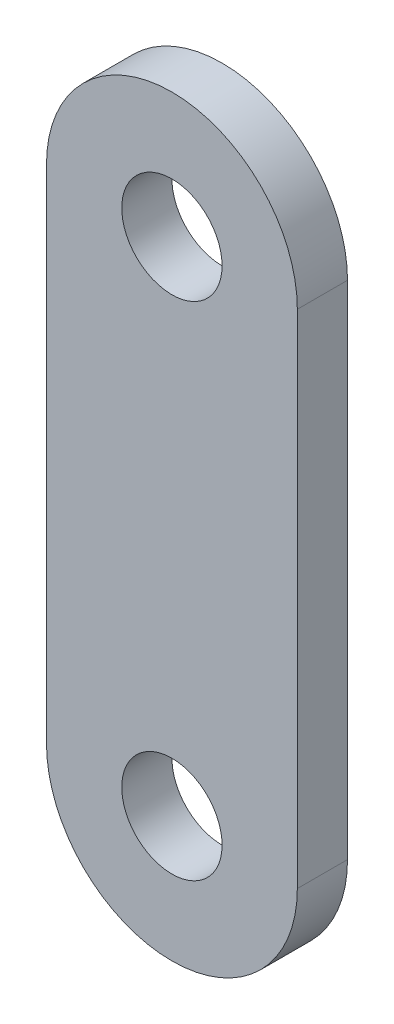
ISO-10303-21;
HEADER;
FILE_DESCRIPTION(('STEP AP214'),'2;1');
FILE_NAME('part.step','',(''),(''),'','','');
FILE_SCHEMA(('AUTOMOTIVE_DESIGN { 1 0 10303 214 1 1 1 1 }'));
ENDSEC;
DATA;
#1=APPLICATION_CONTEXT('core data for automotive mechanical design processes');
#2=APPLICATION_PROTOCOL_DEFINITION('international standard','automotive_design',2000,#1);
#3=PRODUCT_CONTEXT('',#1,'mechanical');
#4=PRODUCT('Part','Part','',(#3));
#5=PRODUCT_RELATED_PRODUCT_CATEGORY('part','',(#4));
#6=PRODUCT_DEFINITION_FORMATION('','',#4);
#7=PRODUCT_DEFINITION_CONTEXT('part definition',#1,'design');
#8=PRODUCT_DEFINITION('design','',#6,#7);
#9=PRODUCT_DEFINITION_SHAPE('','',#8);
#10=(LENGTH_UNIT() NAMED_UNIT(*) SI_UNIT(.MILLI.,.METRE.));
#11=(NAMED_UNIT(*) PLANE_ANGLE_UNIT() SI_UNIT($,.RADIAN.));
#12=(NAMED_UNIT(*) SI_UNIT($,.STERADIAN.) SOLID_ANGLE_UNIT());
#13=UNCERTAINTY_MEASURE_WITH_UNIT(LENGTH_MEASURE(1.E-05),#10,'distance_accuracy_value','');
#14=(GEOMETRIC_REPRESENTATION_CONTEXT(3) GLOBAL_UNCERTAINTY_ASSIGNED_CONTEXT((#13)) GLOBAL_UNIT_ASSIGNED_CONTEXT((#10,
#11,#12)) REPRESENTATION_CONTEXT('',''));
#15=CARTESIAN_POINT('',(0.,0.,0.));
#16=DIRECTION('',(0.,0.,1.));
#17=DIRECTION('',(1.,0.,0.));
#18=AXIS2_PLACEMENT_3D('',#15,#16,#17);
#19=CARTESIAN_POINT('',(25.,0.,10.));
#20=DIRECTION('',(0.,0.,1.));
#21=DIRECTION('',(1.,0.,0.));
#22=AXIS2_PLACEMENT_3D('',#19,#20,#21);
#23=PLANE('',#22);
#24=CARTESIAN_POINT('',(25.,100.,10.));
#25=DIRECTION('',(0.,0.,1.));
#26=DIRECTION('',(1.,0.,0.));
#27=AXIS2_PLACEMENT_3D('',#24,#25,#26);
#28=CIRCLE('',#27,10.);
#29=CARTESIAN_POINT('',(35.,100.,10.));
#30=VERTEX_POINT('',#29);
#31=EDGE_CURVE('E100',#30,#30,#28,.T.);
#32=ORIENTED_EDGE('',*,*,#31,.F.);
#33=EDGE_LOOP('',(#32));
#34=FACE_BOUND('',#33,.T.);
#35=CARTESIAN_POINT('',(25.,0.,10.));
#36=DIRECTION('',(0.,0.,1.));
#37=DIRECTION('',(1.,0.,0.));
#38=AXIS2_PLACEMENT_3D('',#35,#36,#37);
#39=CIRCLE('',#38,25.);
#40=CARTESIAN_POINT('',(0.,0.,10.));
#41=VERTEX_POINT('',#40);
#42=CARTESIAN_POINT('',(50.,0.,10.));
#43=VERTEX_POINT('',#42);
#44=EDGE_CURVE('E85',#41,#43,#39,.T.);
#45=ORIENTED_EDGE('',*,*,#44,.T.);
#46=DIRECTION('',(0.,1.,0.));
#47=VECTOR('',#46,1.);
#48=CARTESIAN_POINT('',(50.,0.,10.));
#49=LINE('',#48,#47);
#50=CARTESIAN_POINT('',(50.,100.,10.));
#51=VERTEX_POINT('',#50);
#52=EDGE_CURVE('E80',#43,#51,#49,.T.);
#53=ORIENTED_EDGE('',*,*,#52,.T.);
#54=CARTESIAN_POINT('',(25.,100.,10.));
#55=DIRECTION('',(0.,0.,1.));
#56=DIRECTION('',(1.,0.,0.));
#57=AXIS2_PLACEMENT_3D('',#54,#55,#56);
#58=CIRCLE('',#57,25.);
#59=CARTESIAN_POINT('',(0.,100.,10.));
#60=VERTEX_POINT('',#59);
#61=EDGE_CURVE('E83',#51,#60,#58,.T.);
#62=ORIENTED_EDGE('',*,*,#61,.T.);
#63=DIRECTION('',(0.,-1.,0.));
#64=VECTOR('',#63,1.);
#65=CARTESIAN_POINT('',(0.,100.,10.));
#66=LINE('',#65,#64);
#67=EDGE_CURVE('E50',#60,#41,#66,.T.);
#68=ORIENTED_EDGE('',*,*,#67,.T.);
#69=EDGE_LOOP('',(#45,#53,#62,#68));
#70=FACE_BOUND('',#69,.T.);
#71=CARTESIAN_POINT('',(25.,0.,10.));
#72=DIRECTION('',(0.,0.,1.));
#73=DIRECTION('',(1.,0.,0.));
#74=AXIS2_PLACEMENT_3D('',#71,#72,#73);
#75=CIRCLE('',#74,10.);
#76=CARTESIAN_POINT('',(35.,0.,10.));
#77=VERTEX_POINT('',#76);
#78=EDGE_CURVE('E115',#77,#77,#75,.T.);
#79=ORIENTED_EDGE('',*,*,#78,.F.);
#80=EDGE_LOOP('',(#79));
#81=FACE_BOUND('',#80,.T.);
#82=ADVANCED_FACE('F33',(#34,#70,#81),#23,.T.);
#83=CARTESIAN_POINT('',(25.,0.,0.));
#84=DIRECTION('',(0.,0.,1.));
#85=DIRECTION('',(1.,0.,0.));
#86=AXIS2_PLACEMENT_3D('',#83,#84,#85);
#87=PLANE('',#86);
#88=CARTESIAN_POINT('',(25.,100.,0.));
#89=DIRECTION('',(0.,0.,1.));
#90=DIRECTION('',(1.,0.,0.));
#91=AXIS2_PLACEMENT_3D('',#88,#89,#90);
#92=CIRCLE('',#91,10.);
#93=CARTESIAN_POINT('',(35.,100.,0.));
#94=VERTEX_POINT('',#93);
#95=EDGE_CURVE('E112',#94,#94,#92,.T.);
#96=ORIENTED_EDGE('',*,*,#95,.T.);
#97=EDGE_LOOP('',(#96));
#98=FACE_BOUND('',#97,.T.);
#99=CARTESIAN_POINT('',(25.,0.,0.));
#100=DIRECTION('',(0.,0.,1.));
#101=DIRECTION('',(1.,0.,0.));
#102=AXIS2_PLACEMENT_3D('',#99,#100,#101);
#103=CIRCLE('',#102,25.);
#104=CARTESIAN_POINT('',(0.,0.,0.));
#105=VERTEX_POINT('',#104);
#106=CARTESIAN_POINT('',(50.,0.,0.));
#107=VERTEX_POINT('',#106);
#108=EDGE_CURVE('E97',#105,#107,#103,.T.);
#109=ORIENTED_EDGE('',*,*,#108,.F.);
#110=DIRECTION('',(0.,-1.,0.));
#111=VECTOR('',#110,1.);
#112=CARTESIAN_POINT('',(0.,100.,0.));
#113=LINE('',#112,#111);
#114=CARTESIAN_POINT('',(0.,100.,0.));
#115=VERTEX_POINT('',#114);
#116=EDGE_CURVE('E73',#115,#105,#113,.T.);
#117=ORIENTED_EDGE('',*,*,#116,.F.);
#118=CARTESIAN_POINT('',(25.,100.,0.));
#119=DIRECTION('',(0.,0.,1.));
#120=DIRECTION('',(1.,0.,0.));
#121=AXIS2_PLACEMENT_3D('',#118,#119,#120);
#122=CIRCLE('',#121,25.);
#123=CARTESIAN_POINT('',(50.,100.,0.));
#124=VERTEX_POINT('',#123);
#125=EDGE_CURVE('E67',#124,#115,#122,.T.);
#126=ORIENTED_EDGE('',*,*,#125,.F.);
#127=DIRECTION('',(0.,1.,0.));
#128=VECTOR('',#127,1.);
#129=CARTESIAN_POINT('',(50.,0.,0.));
#130=LINE('',#129,#128);
#131=EDGE_CURVE('E89',#107,#124,#130,.T.);
#132=ORIENTED_EDGE('',*,*,#131,.F.);
#133=EDGE_LOOP('',(#109,#117,#126,#132));
#134=FACE_BOUND('',#133,.T.);
#135=CARTESIAN_POINT('',(25.,0.,0.));
#136=DIRECTION('',(0.,0.,1.));
#137=DIRECTION('',(1.,0.,0.));
#138=AXIS2_PLACEMENT_3D('',#135,#136,#137);
#139=CIRCLE('',#138,10.);
#140=CARTESIAN_POINT('',(35.,0.,0.));
#141=VERTEX_POINT('',#140);
#142=EDGE_CURVE('E118',#141,#141,#139,.T.);
#143=ORIENTED_EDGE('',*,*,#142,.T.);
#144=EDGE_LOOP('',(#143));
#145=FACE_BOUND('',#144,.T.);
#146=ADVANCED_FACE('F108',(#98,#134,#145),#87,.F.);
#147=CARTESIAN_POINT('',(25.,0.,10.));
#148=DIRECTION('',(0.,0.,-1.));
#149=DIRECTION('',(-1.,0.,0.));
#150=AXIS2_PLACEMENT_3D('',#147,#148,#149);
#151=CYLINDRICAL_SURFACE('',#150,25.);
#152=ORIENTED_EDGE('',*,*,#108,.T.);
#153=DIRECTION('',(0.,0.,-1.));
#154=VECTOR('',#153,1.);
#155=CARTESIAN_POINT('',(50.,0.,10.));
#156=LINE('',#155,#154);
#157=EDGE_CURVE('E11',#43,#107,#156,.T.);
#158=ORIENTED_EDGE('',*,*,#157,.F.);
#159=ORIENTED_EDGE('',*,*,#44,.F.);
#160=DIRECTION('',(0.,0.,-1.));
#161=VECTOR('',#160,1.);
#162=CARTESIAN_POINT('',(0.,0.,10.));
#163=LINE('',#162,#161);
#164=EDGE_CURVE('E93',#41,#105,#163,.T.);
#165=ORIENTED_EDGE('',*,*,#164,.T.);
#166=EDGE_LOOP('',(#152,#158,#159,#165));
#167=FACE_BOUND('',#166,.T.);
#168=ADVANCED_FACE('F35',(#167),#151,.T.);
#169=CARTESIAN_POINT('',(50.,0.,10.));
#170=DIRECTION('',(-1.,0.,0.));
#171=DIRECTION('',(0.,-1.,0.));
#172=AXIS2_PLACEMENT_3D('',#169,#170,#171);
#173=PLANE('',#172);
#174=ORIENTED_EDGE('',*,*,#131,.T.);
#175=DIRECTION('',(0.,0.,-1.));
#176=VECTOR('',#175,1.);
#177=CARTESIAN_POINT('',(50.,100.,10.));
#178=LINE('',#177,#176);
#179=EDGE_CURVE('E42',#51,#124,#178,.T.);
#180=ORIENTED_EDGE('',*,*,#179,.F.);
#181=ORIENTED_EDGE('',*,*,#52,.F.);
#182=ORIENTED_EDGE('',*,*,#157,.T.);
#183=EDGE_LOOP('',(#174,#180,#181,#182));
#184=FACE_BOUND('',#183,.T.);
#185=ADVANCED_FACE('F88',(#184),#173,.F.);
#186=CARTESIAN_POINT('',(25.,100.,10.));
#187=DIRECTION('',(0.,0.,-1.));
#188=DIRECTION('',(-1.,0.,0.));
#189=AXIS2_PLACEMENT_3D('',#186,#187,#188);
#190=CYLINDRICAL_SURFACE('',#189,25.);
#191=ORIENTED_EDGE('',*,*,#125,.T.);
#192=DIRECTION('',(0.,0.,-1.));
#193=VECTOR('',#192,1.);
#194=CARTESIAN_POINT('',(0.,100.,10.));
#195=LINE('',#194,#193);
#196=EDGE_CURVE('E90',#60,#115,#195,.T.);
#197=ORIENTED_EDGE('',*,*,#196,.F.);
#198=ORIENTED_EDGE('',*,*,#61,.F.);
#199=ORIENTED_EDGE('',*,*,#179,.T.);
#200=EDGE_LOOP('',(#191,#197,#198,#199));
#201=FACE_BOUND('',#200,.T.);
#202=ADVANCED_FACE('F91',(#201),#190,.T.);
#203=CARTESIAN_POINT('',(0.,100.,10.));
#204=DIRECTION('',(1.,0.,0.));
#205=DIRECTION('',(0.,1.,0.));
#206=AXIS2_PLACEMENT_3D('',#203,#204,#205);
#207=PLANE('',#206);
#208=ORIENTED_EDGE('',*,*,#116,.T.);
#209=ORIENTED_EDGE('',*,*,#164,.F.);
#210=ORIENTED_EDGE('',*,*,#67,.F.);
#211=ORIENTED_EDGE('',*,*,#196,.T.);
#212=EDGE_LOOP('',(#208,#209,#210,#211));
#213=FACE_BOUND('',#212,.T.);
#214=ADVANCED_FACE('F105',(#213),#207,.F.);
#215=CARTESIAN_POINT('',(25.,100.,10.));
#216=DIRECTION('',(0.,0.,-1.));
#217=DIRECTION('',(-1.,0.,0.));
#218=AXIS2_PLACEMENT_3D('',#215,#216,#217);
#219=CYLINDRICAL_SURFACE('',#218,10.);
#220=ORIENTED_EDGE('',*,*,#31,.T.);
#221=EDGE_LOOP('',(#220));
#222=FACE_BOUND('',#221,.T.);
#223=ORIENTED_EDGE('',*,*,#95,.F.);
#224=EDGE_LOOP('',(#223));
#225=FACE_BOUND('',#224,.T.);
#226=ADVANCED_FACE('F136',(#222,#225),#219,.F.);
#227=CARTESIAN_POINT('',(25.,0.,10.));
#228=DIRECTION('',(0.,0.,-1.));
#229=DIRECTION('',(-1.,0.,0.));
#230=AXIS2_PLACEMENT_3D('',#227,#228,#229);
#231=CYLINDRICAL_SURFACE('',#230,10.);
#232=ORIENTED_EDGE('',*,*,#78,.T.);
#233=EDGE_LOOP('',(#232));
#234=FACE_BOUND('',#233,.T.);
#235=ORIENTED_EDGE('',*,*,#142,.F.);
#236=EDGE_LOOP('',(#235));
#237=FACE_BOUND('',#236,.T.);
#238=ADVANCED_FACE('F124',(#234,#237),#231,.F.);
#239=CLOSED_SHELL('',(#82,#146,#168,#185,#202,#214,#226,#238));
#240=MANIFOLD_SOLID_BREP('B2',#239);
#241=ADVANCED_BREP_SHAPE_REPRESENTATION('',(#18,#240),#14);
#242=SHAPE_DEFINITION_REPRESENTATION(#9,#241);
ENDSEC;
END-ISO-10303-21;
